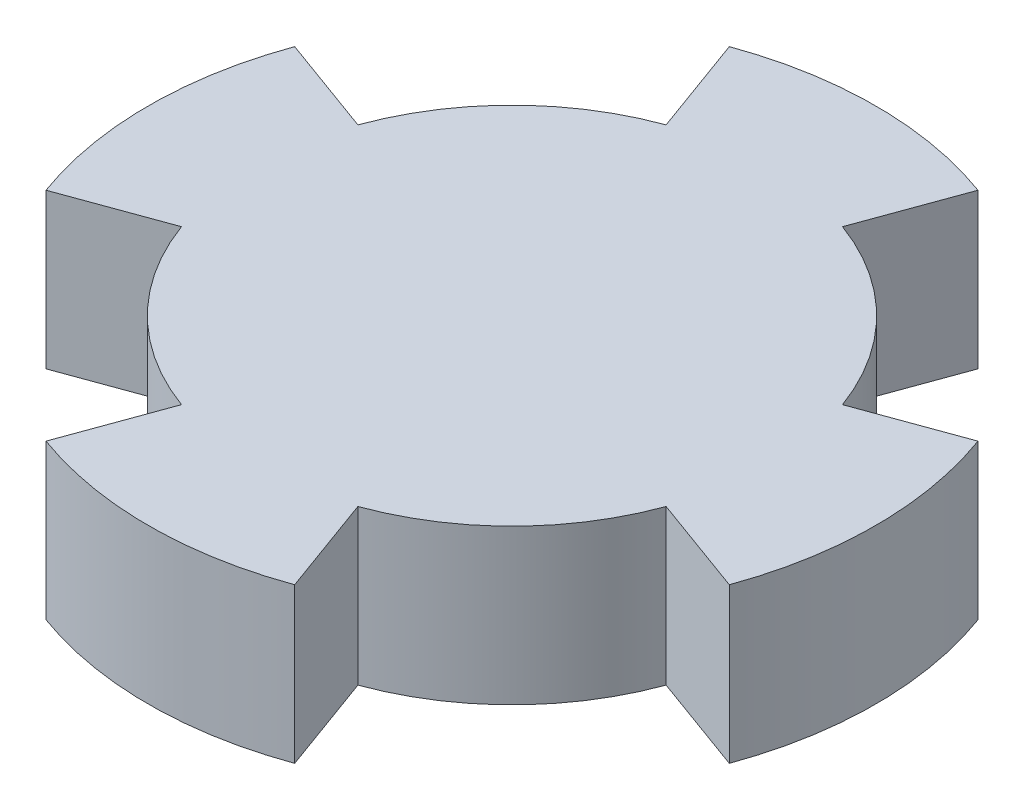
ISO-10303-21;
HEADER;
FILE_DESCRIPTION(('STEP AP214'),'2;1');
FILE_NAME('part.step','',(''),(''),'','','');
FILE_SCHEMA(('AUTOMOTIVE_DESIGN { 1 0 10303 214 1 1 1 1 }'));
ENDSEC;
DATA;
#1=APPLICATION_CONTEXT('core data for automotive mechanical design processes');
#2=APPLICATION_PROTOCOL_DEFINITION('international standard','automotive_design',2000,#1);
#3=PRODUCT_CONTEXT('',#1,'mechanical');
#4=PRODUCT('Part','Part','',(#3));
#5=PRODUCT_RELATED_PRODUCT_CATEGORY('part','',(#4));
#6=PRODUCT_DEFINITION_FORMATION('','',#4);
#7=PRODUCT_DEFINITION_CONTEXT('part definition',#1,'design');
#8=PRODUCT_DEFINITION('design','',#6,#7);
#9=PRODUCT_DEFINITION_SHAPE('','',#8);
#10=(LENGTH_UNIT() NAMED_UNIT(*) SI_UNIT(.MILLI.,.METRE.));
#11=(NAMED_UNIT(*) PLANE_ANGLE_UNIT() SI_UNIT($,.RADIAN.));
#12=(NAMED_UNIT(*) SI_UNIT($,.STERADIAN.) SOLID_ANGLE_UNIT());
#13=UNCERTAINTY_MEASURE_WITH_UNIT(LENGTH_MEASURE(1.E-05),#10,'distance_accuracy_value','');
#14=(GEOMETRIC_REPRESENTATION_CONTEXT(3) GLOBAL_UNCERTAINTY_ASSIGNED_CONTEXT((#13)) GLOBAL_UNIT_ASSIGNED_CONTEXT((#10,
#11,#12)) REPRESENTATION_CONTEXT('',''));
#15=CARTESIAN_POINT('',(0.,0.,0.));
#16=DIRECTION('',(0.,0.,1.));
#17=DIRECTION('',(1.,0.,0.));
#18=AXIS2_PLACEMENT_3D('',#15,#16,#17);
#19=CARTESIAN_POINT('',(0.,150.,0.));
#20=DIRECTION('',(0.,-1.,0.));
#21=DIRECTION('',(0.,0.,-1.));
#22=AXIS2_PLACEMENT_3D('',#19,#20,#21);
#23=CYLINDRICAL_SURFACE('',#22,352.5);
#24=CARTESIAN_POINT('',(0.,0.,0.));
#25=DIRECTION('',(0.,1.,0.));
#26=DIRECTION('',(0.,0.,1.));
#27=AXIS2_PLACEMENT_3D('',#24,#25,#26);
#28=CIRCLE('',#27,352.5);
#29=CARTESIAN_POINT('',(-120.562100522298,0.,331.241648827033));
#30=VERTEX_POINT('',#29);
#31=CARTESIAN_POINT('',(120.562100522295,0.,331.241648827034));
#32=VERTEX_POINT('',#31);
#33=EDGE_CURVE('E181',#30,#32,#28,.T.);
#34=ORIENTED_EDGE('',*,*,#33,.T.);
#35=DIRECTION('',(0.,-1.,0.));
#36=VECTOR('',#35,1.);
#37=CARTESIAN_POINT('',(120.562100522295,150.,331.241648827034));
#38=LINE('',#37,#36);
#39=CARTESIAN_POINT('',(120.562100522295,150.,331.241648827034));
#40=VERTEX_POINT('',#39);
#41=EDGE_CURVE('E11',#40,#32,#38,.T.);
#42=ORIENTED_EDGE('',*,*,#41,.F.);
#43=CARTESIAN_POINT('',(0.,150.,0.));
#44=DIRECTION('',(0.,1.,0.));
#45=DIRECTION('',(0.,0.,1.));
#46=AXIS2_PLACEMENT_3D('',#43,#44,#45);
#47=CIRCLE('',#46,352.5);
#48=CARTESIAN_POINT('',(-120.562100522298,150.,331.241648827033));
#49=VERTEX_POINT('',#48);
#50=EDGE_CURVE('E211',#49,#40,#47,.T.);
#51=ORIENTED_EDGE('',*,*,#50,.F.);
#52=DIRECTION('',(0.,-1.,0.));
#53=VECTOR('',#52,1.);
#54=CARTESIAN_POINT('',(-120.562100522298,150.,331.241648827033));
#55=LINE('',#54,#53);
#56=EDGE_CURVE('E177',#49,#30,#55,.T.);
#57=ORIENTED_EDGE('',*,*,#56,.T.);
#58=EDGE_LOOP('',(#34,#42,#51,#57));
#59=FACE_BOUND('',#58,.T.);
#60=ADVANCED_FACE('F37',(#59),#23,.T.);
#61=CARTESIAN_POINT('',(0.,150.,0.));
#62=DIRECTION('',(-0.939692620785912,0.,0.34202014332566));
#63=DIRECTION('',(0.34202014332566,0.,0.939692620785912));
#64=AXIS2_PLACEMENT_3D('',#61,#62,#63);
#65=PLANE('',#64);
#66=DIRECTION('',(-0.34202014332566,0.,-0.939692620785912));
#67=VECTOR('',#66,1.);
#68=CARTESIAN_POINT('',(0.,0.,0.));
#69=LINE('',#68,#67);
#70=CARTESIAN_POINT('',(85.5050358314149,0.,234.923155196478));
#71=VERTEX_POINT('',#70);
#72=EDGE_CURVE('E184',#32,#71,#69,.T.);
#73=ORIENTED_EDGE('',*,*,#72,.T.);
#74=DIRECTION('',(0.,-1.,0.));
#75=VECTOR('',#74,1.);
#76=CARTESIAN_POINT('',(85.5050358314149,150.,234.923155196478));
#77=LINE('',#76,#75);
#78=CARTESIAN_POINT('',(85.5050358314149,150.,234.923155196478));
#79=VERTEX_POINT('',#78);
#80=EDGE_CURVE('E45',#79,#71,#77,.T.);
#81=ORIENTED_EDGE('',*,*,#80,.F.);
#82=DIRECTION('',(-0.34202014332566,0.,-0.939692620785912));
#83=VECTOR('',#82,1.);
#84=CARTESIAN_POINT('',(0.,150.,0.));
#85=LINE('',#84,#83);
#86=EDGE_CURVE('E120',#40,#79,#85,.T.);
#87=ORIENTED_EDGE('',*,*,#86,.F.);
#88=ORIENTED_EDGE('',*,*,#41,.T.);
#89=EDGE_LOOP('',(#73,#81,#87,#88));
#90=FACE_BOUND('',#89,.T.);
#91=ADVANCED_FACE('F309',(#90),#65,.F.);
#92=CARTESIAN_POINT('',(0.,150.,0.));
#93=DIRECTION('',(0.,-1.,0.));
#94=DIRECTION('',(0.,0.,-1.));
#95=AXIS2_PLACEMENT_3D('',#92,#93,#94);
#96=CYLINDRICAL_SURFACE('',#95,250.);
#97=CARTESIAN_POINT('',(0.,0.,0.));
#98=DIRECTION('',(0.,1.,0.));
#99=DIRECTION('',(0.,0.,1.));
#100=AXIS2_PLACEMENT_3D('',#97,#98,#99);
#101=CIRCLE('',#100,250.);
#102=CARTESIAN_POINT('',(234.923155196476,0.,85.5050358314198));
#103=VERTEX_POINT('',#102);
#104=EDGE_CURVE('E186',#71,#103,#101,.T.);
#105=ORIENTED_EDGE('',*,*,#104,.T.);
#106=DIRECTION('',(0.,-1.,0.));
#107=VECTOR('',#106,1.);
#108=CARTESIAN_POINT('',(234.923155196476,150.,85.5050358314198));
#109=LINE('',#108,#107);
#110=CARTESIAN_POINT('',(234.923155196476,150.,85.5050358314198));
#111=VERTEX_POINT('',#110);
#112=EDGE_CURVE('E242',#111,#103,#109,.T.);
#113=ORIENTED_EDGE('',*,*,#112,.F.);
#114=CARTESIAN_POINT('',(0.,150.,0.));
#115=DIRECTION('',(0.,1.,0.));
#116=DIRECTION('',(0.,0.,1.));
#117=AXIS2_PLACEMENT_3D('',#114,#115,#116);
#118=CIRCLE('',#117,250.);
#119=EDGE_CURVE('E250',#79,#111,#118,.T.);
#120=ORIENTED_EDGE('',*,*,#119,.F.);
#121=ORIENTED_EDGE('',*,*,#80,.T.);
#122=EDGE_LOOP('',(#105,#113,#120,#121));
#123=FACE_BOUND('',#122,.T.);
#124=ADVANCED_FACE('F248',(#123),#96,.T.);
#125=CARTESIAN_POINT('',(0.,150.,0.));
#126=DIRECTION('',(0.342020143325679,0.,-0.939692620785905));
#127=DIRECTION('',(-0.939692620785905,0.,-0.342020143325679));
#128=AXIS2_PLACEMENT_3D('',#125,#126,#127);
#129=PLANE('',#128);
#130=DIRECTION('',(0.939692620785905,0.,0.342020143325679));
#131=VECTOR('',#130,1.);
#132=CARTESIAN_POINT('',(0.,0.,0.));
#133=LINE('',#132,#131);
#134=CARTESIAN_POINT('',(331.241648827031,0.,120.562100522302));
#135=VERTEX_POINT('',#134);
#136=EDGE_CURVE('E188',#103,#135,#133,.T.);
#137=ORIENTED_EDGE('',*,*,#136,.T.);
#138=DIRECTION('',(0.,-1.,0.));
#139=VECTOR('',#138,1.);
#140=CARTESIAN_POINT('',(331.241648827031,150.,120.562100522302));
#141=LINE('',#140,#139);
#142=CARTESIAN_POINT('',(331.241648827031,150.,120.562100522302));
#143=VERTEX_POINT('',#142);
#144=EDGE_CURVE('E239',#143,#135,#141,.T.);
#145=ORIENTED_EDGE('',*,*,#144,.F.);
#146=DIRECTION('',(0.939692620785905,0.,0.342020143325679));
#147=VECTOR('',#146,1.);
#148=CARTESIAN_POINT('',(0.,150.,0.));
#149=LINE('',#148,#147);
#150=EDGE_CURVE('E268',#111,#143,#149,.T.);
#151=ORIENTED_EDGE('',*,*,#150,.F.);
#152=ORIENTED_EDGE('',*,*,#112,.T.);
#153=EDGE_LOOP('',(#137,#145,#151,#152));
#154=FACE_BOUND('',#153,.T.);
#155=ADVANCED_FACE('F259',(#154),#129,.F.);
#156=CARTESIAN_POINT('',(0.,150.,0.));
#157=DIRECTION('',(0.,-1.,0.));
#158=DIRECTION('',(0.,0.,-1.));
#159=AXIS2_PLACEMENT_3D('',#156,#157,#158);
#160=CYLINDRICAL_SURFACE('',#159,352.5);
#161=CARTESIAN_POINT('',(0.,0.,0.));
#162=DIRECTION('',(0.,1.,0.));
#163=DIRECTION('',(0.,0.,1.));
#164=AXIS2_PLACEMENT_3D('',#161,#162,#163);
#165=CIRCLE('',#164,352.5);
#166=CARTESIAN_POINT('',(331.241648827033,0.,-120.562100522305));
#167=VERTEX_POINT('',#166);
#168=EDGE_CURVE('E190',#135,#167,#165,.T.);
#169=ORIENTED_EDGE('',*,*,#168,.T.);
#170=DIRECTION('',(0.,-1.,0.));
#171=VECTOR('',#170,1.);
#172=CARTESIAN_POINT('',(331.241648827033,150.,-120.562100522305));
#173=LINE('',#172,#171);
#174=CARTESIAN_POINT('',(331.241648827033,150.,-120.562100522305));
#175=VERTEX_POINT('',#174);
#176=EDGE_CURVE('E236',#175,#167,#173,.T.);
#177=ORIENTED_EDGE('',*,*,#176,.F.);
#178=CARTESIAN_POINT('',(0.,150.,0.));
#179=DIRECTION('',(0.,1.,0.));
#180=DIRECTION('',(0.,0.,1.));
#181=AXIS2_PLACEMENT_3D('',#178,#179,#180);
#182=CIRCLE('',#181,352.5);
#183=EDGE_CURVE('E265',#143,#175,#182,.T.);
#184=ORIENTED_EDGE('',*,*,#183,.F.);
#185=ORIENTED_EDGE('',*,*,#144,.T.);
#186=EDGE_LOOP('',(#169,#177,#184,#185));
#187=FACE_BOUND('',#186,.T.);
#188=ADVANCED_FACE('F263',(#187),#160,.T.);
#189=CARTESIAN_POINT('',(0.,150.,0.));
#190=DIRECTION('',(0.342020143325686,0.,0.939692620785902));
#191=DIRECTION('',(0.939692620785902,0.,-0.342020143325686));
#192=AXIS2_PLACEMENT_3D('',#189,#190,#191);
#193=PLANE('',#192);
#194=DIRECTION('',(-0.939692620785902,0.,0.342020143325686));
#195=VECTOR('',#194,1.);
#196=CARTESIAN_POINT('',(0.,0.,0.));
#197=LINE('',#196,#195);
#198=CARTESIAN_POINT('',(234.923155196478,0.,-85.5050358314223));
#199=VERTEX_POINT('',#198);
#200=EDGE_CURVE('E192',#167,#199,#197,.T.);
#201=ORIENTED_EDGE('',*,*,#200,.T.);
#202=DIRECTION('',(0.,-1.,0.));
#203=VECTOR('',#202,1.);
#204=CARTESIAN_POINT('',(234.923155196478,150.,-85.5050358314223));
#205=LINE('',#204,#203);
#206=CARTESIAN_POINT('',(234.923155196478,150.,-85.5050358314223));
#207=VERTEX_POINT('',#206);
#208=EDGE_CURVE('E233',#207,#199,#205,.T.);
#209=ORIENTED_EDGE('',*,*,#208,.F.);
#210=DIRECTION('',(-0.939692620785902,0.,0.342020143325686));
#211=VECTOR('',#210,1.);
#212=CARTESIAN_POINT('',(0.,150.,0.));
#213=LINE('',#212,#211);
#214=EDGE_CURVE('E267',#175,#207,#213,.T.);
#215=ORIENTED_EDGE('',*,*,#214,.F.);
#216=ORIENTED_EDGE('',*,*,#176,.T.);
#217=EDGE_LOOP('',(#201,#209,#215,#216));
#218=FACE_BOUND('',#217,.T.);
#219=ADVANCED_FACE('F322',(#218),#193,.F.);
#220=CARTESIAN_POINT('',(0.,150.,0.));
#221=DIRECTION('',(0.,-1.,0.));
#222=DIRECTION('',(0.,0.,-1.));
#223=AXIS2_PLACEMENT_3D('',#220,#221,#222);
#224=CYLINDRICAL_SURFACE('',#223,250.);
#225=CARTESIAN_POINT('',(0.,0.,0.));
#226=DIRECTION('',(0.,1.,0.));
#227=DIRECTION('',(0.,0.,1.));
#228=AXIS2_PLACEMENT_3D('',#225,#226,#227);
#229=CIRCLE('',#228,250.);
#230=CARTESIAN_POINT('',(85.505035831419,0.,-234.923155196476));
#231=VERTEX_POINT('',#230);
#232=EDGE_CURVE('E194',#199,#231,#229,.T.);
#233=ORIENTED_EDGE('',*,*,#232,.T.);
#234=DIRECTION('',(0.,-1.,0.));
#235=VECTOR('',#234,1.);
#236=CARTESIAN_POINT('',(85.505035831419,150.,-234.923155196476));
#237=LINE('',#236,#235);
#238=CARTESIAN_POINT('',(85.505035831419,150.,-234.923155196476));
#239=VERTEX_POINT('',#238);
#240=EDGE_CURVE('E230',#239,#231,#237,.T.);
#241=ORIENTED_EDGE('',*,*,#240,.F.);
#242=CARTESIAN_POINT('',(0.,150.,0.));
#243=DIRECTION('',(0.,1.,0.));
#244=DIRECTION('',(0.,0.,1.));
#245=AXIS2_PLACEMENT_3D('',#242,#243,#244);
#246=CIRCLE('',#245,250.);
#247=EDGE_CURVE('E270',#207,#239,#246,.T.);
#248=ORIENTED_EDGE('',*,*,#247,.F.);
#249=ORIENTED_EDGE('',*,*,#208,.T.);
#250=EDGE_LOOP('',(#233,#241,#248,#249));
#251=FACE_BOUND('',#250,.T.);
#252=ADVANCED_FACE('F325',(#251),#224,.T.);
#253=CARTESIAN_POINT('',(0.,150.,0.));
#254=DIRECTION('',(-0.939692620785906,0.,-0.342020143325676));
#255=DIRECTION('',(-0.342020143325676,0.,0.939692620785906));
#256=AXIS2_PLACEMENT_3D('',#253,#254,#255);
#257=PLANE('',#256);
#258=DIRECTION('',(0.342020143325676,0.,-0.939692620785906));
#259=VECTOR('',#258,1.);
#260=CARTESIAN_POINT('',(0.,0.,0.));
#261=LINE('',#260,#259);
#262=CARTESIAN_POINT('',(120.562100522301,0.,-331.241648827032));
#263=VERTEX_POINT('',#262);
#264=EDGE_CURVE('E196',#231,#263,#261,.T.);
#265=ORIENTED_EDGE('',*,*,#264,.T.);
#266=DIRECTION('',(0.,-1.,0.));
#267=VECTOR('',#266,1.);
#268=CARTESIAN_POINT('',(120.562100522301,150.,-331.241648827032));
#269=LINE('',#268,#267);
#270=CARTESIAN_POINT('',(120.562100522301,150.,-331.241648827032));
#271=VERTEX_POINT('',#270);
#272=EDGE_CURVE('E227',#271,#263,#269,.T.);
#273=ORIENTED_EDGE('',*,*,#272,.F.);
#274=DIRECTION('',(0.342020143325676,0.,-0.939692620785906));
#275=VECTOR('',#274,1.);
#276=CARTESIAN_POINT('',(0.,150.,0.));
#277=LINE('',#276,#275);
#278=EDGE_CURVE('E276',#239,#271,#277,.T.);
#279=ORIENTED_EDGE('',*,*,#278,.F.);
#280=ORIENTED_EDGE('',*,*,#240,.T.);
#281=EDGE_LOOP('',(#265,#273,#279,#280));
#282=FACE_BOUND('',#281,.T.);
#283=ADVANCED_FACE('F329',(#282),#257,.F.);
#284=CARTESIAN_POINT('',(0.,150.,0.));
#285=DIRECTION('',(0.,-1.,0.));
#286=DIRECTION('',(0.,0.,-1.));
#287=AXIS2_PLACEMENT_3D('',#284,#285,#286);
#288=CYLINDRICAL_SURFACE('',#287,352.5);
#289=CARTESIAN_POINT('',(0.,0.,0.));
#290=DIRECTION('',(0.,1.,0.));
#291=DIRECTION('',(0.,0.,1.));
#292=AXIS2_PLACEMENT_3D('',#289,#290,#291);
#293=CIRCLE('',#292,352.5);
#294=CARTESIAN_POINT('',(-120.562100522297,0.,-331.241648827033));
#295=VERTEX_POINT('',#294);
#296=EDGE_CURVE('E198',#263,#295,#293,.T.);
#297=ORIENTED_EDGE('',*,*,#296,.T.);
#298=DIRECTION('',(0.,-1.,0.));
#299=VECTOR('',#298,1.);
#300=CARTESIAN_POINT('',(-120.562100522297,150.,-331.241648827033));
#301=LINE('',#300,#299);
#302=CARTESIAN_POINT('',(-120.562100522297,150.,-331.241648827033));
#303=VERTEX_POINT('',#302);
#304=EDGE_CURVE('E224',#303,#295,#301,.T.);
#305=ORIENTED_EDGE('',*,*,#304,.F.);
#306=CARTESIAN_POINT('',(0.,150.,0.));
#307=DIRECTION('',(0.,1.,0.));
#308=DIRECTION('',(0.,0.,1.));
#309=AXIS2_PLACEMENT_3D('',#306,#307,#308);
#310=CIRCLE('',#309,352.5);
#311=EDGE_CURVE('E278',#271,#303,#310,.T.);
#312=ORIENTED_EDGE('',*,*,#311,.F.);
#313=ORIENTED_EDGE('',*,*,#272,.T.);
#314=EDGE_LOOP('',(#297,#305,#312,#313));
#315=FACE_BOUND('',#314,.T.);
#316=ADVANCED_FACE('F333',(#315),#288,.T.);
#317=CARTESIAN_POINT('',(0.,150.,0.));
#318=DIRECTION('',(0.939692620785909,0.,-0.342020143325666));
#319=DIRECTION('',(-0.342020143325666,0.,-0.939692620785909));
#320=AXIS2_PLACEMENT_3D('',#317,#318,#319);
#321=PLANE('',#320);
#322=DIRECTION('',(0.342020143325666,0.,0.939692620785909));
#323=VECTOR('',#322,1.);
#324=CARTESIAN_POINT('',(0.,0.,0.));
#325=LINE('',#324,#323);
#326=CARTESIAN_POINT('',(-85.5050358314165,0.,-234.923155196477));
#327=VERTEX_POINT('',#326);
#328=EDGE_CURVE('E200',#295,#327,#325,.T.);
#329=ORIENTED_EDGE('',*,*,#328,.T.);
#330=DIRECTION('',(0.,-1.,0.));
#331=VECTOR('',#330,1.);
#332=CARTESIAN_POINT('',(-85.5050358314165,150.,-234.923155196477));
#333=LINE('',#332,#331);
#334=CARTESIAN_POINT('',(-85.5050358314165,150.,-234.923155196477));
#335=VERTEX_POINT('',#334);
#336=EDGE_CURVE('E221',#335,#327,#333,.T.);
#337=ORIENTED_EDGE('',*,*,#336,.F.);
#338=DIRECTION('',(0.342020143325666,0.,0.939692620785909));
#339=VECTOR('',#338,1.);
#340=CARTESIAN_POINT('',(0.,150.,0.));
#341=LINE('',#340,#339);
#342=EDGE_CURVE('E280',#303,#335,#341,.T.);
#343=ORIENTED_EDGE('',*,*,#342,.F.);
#344=ORIENTED_EDGE('',*,*,#304,.T.);
#345=EDGE_LOOP('',(#329,#337,#343,#344));
#346=FACE_BOUND('',#345,.T.);
#347=ADVANCED_FACE('F337',(#346),#321,.F.);
#348=CARTESIAN_POINT('',(0.,150.,0.));
#349=DIRECTION('',(0.,-1.,0.));
#350=DIRECTION('',(0.,0.,-1.));
#351=AXIS2_PLACEMENT_3D('',#348,#349,#350);
#352=CYLINDRICAL_SURFACE('',#351,250.);
#353=CARTESIAN_POINT('',(0.,0.,0.));
#354=DIRECTION('',(0.,1.,0.));
#355=DIRECTION('',(0.,0.,1.));
#356=AXIS2_PLACEMENT_3D('',#353,#354,#355);
#357=CIRCLE('',#356,250.);
#358=CARTESIAN_POINT('',(-234.923155196477,0.,-85.5050358314182));
#359=VERTEX_POINT('',#358);
#360=EDGE_CURVE('E202',#327,#359,#357,.T.);
#361=ORIENTED_EDGE('',*,*,#360,.T.);
#362=DIRECTION('',(0.,-1.,0.));
#363=VECTOR('',#362,1.);
#364=CARTESIAN_POINT('',(-234.923155196477,150.,-85.5050358314182));
#365=LINE('',#364,#363);
#366=CARTESIAN_POINT('',(-234.923155196477,150.,-85.5050358314182));
#367=VERTEX_POINT('',#366);
#368=EDGE_CURVE('E218',#367,#359,#365,.T.);
#369=ORIENTED_EDGE('',*,*,#368,.F.);
#370=CARTESIAN_POINT('',(0.,150.,0.));
#371=DIRECTION('',(0.,1.,0.));
#372=DIRECTION('',(0.,0.,1.));
#373=AXIS2_PLACEMENT_3D('',#370,#371,#372);
#374=CIRCLE('',#373,250.);
#375=EDGE_CURVE('E282',#335,#367,#374,.T.);
#376=ORIENTED_EDGE('',*,*,#375,.F.);
#377=ORIENTED_EDGE('',*,*,#336,.T.);
#378=EDGE_LOOP('',(#361,#369,#376,#377));
#379=FACE_BOUND('',#378,.T.);
#380=ADVANCED_FACE('F341',(#379),#352,.T.);
#381=CARTESIAN_POINT('',(0.,150.,0.));
#382=DIRECTION('',(-0.342020143325673,0.,0.939692620785907));
#383=DIRECTION('',(0.939692620785907,0.,0.342020143325673));
#384=AXIS2_PLACEMENT_3D('',#381,#382,#383);
#385=PLANE('',#384);
#386=DIRECTION('',(-0.939692620785907,0.,-0.342020143325673));
#387=VECTOR('',#386,1.);
#388=CARTESIAN_POINT('',(0.,0.,0.));
#389=LINE('',#388,#387);
#390=CARTESIAN_POINT('',(-331.241648827032,0.,-120.5621005223));
#391=VERTEX_POINT('',#390);
#392=EDGE_CURVE('E204',#359,#391,#389,.T.);
#393=ORIENTED_EDGE('',*,*,#392,.T.);
#394=DIRECTION('',(0.,-1.,0.));
#395=VECTOR('',#394,1.);
#396=CARTESIAN_POINT('',(-331.241648827032,150.,-120.5621005223));
#397=LINE('',#396,#395);
#398=CARTESIAN_POINT('',(-331.241648827032,150.,-120.5621005223));
#399=VERTEX_POINT('',#398);
#400=EDGE_CURVE('E215',#399,#391,#397,.T.);
#401=ORIENTED_EDGE('',*,*,#400,.F.);
#402=DIRECTION('',(-0.939692620785907,0.,-0.342020143325673));
#403=VECTOR('',#402,1.);
#404=CARTESIAN_POINT('',(0.,150.,0.));
#405=LINE('',#404,#403);
#406=EDGE_CURVE('E284',#367,#399,#405,.T.);
#407=ORIENTED_EDGE('',*,*,#406,.F.);
#408=ORIENTED_EDGE('',*,*,#368,.T.);
#409=EDGE_LOOP('',(#393,#401,#407,#408));
#410=FACE_BOUND('',#409,.T.);
#411=ADVANCED_FACE('F290',(#410),#385,.F.);
#412=CARTESIAN_POINT('',(0.,150.,0.));
#413=DIRECTION('',(0.,-1.,0.));
#414=DIRECTION('',(0.,0.,-1.));
#415=AXIS2_PLACEMENT_3D('',#412,#413,#414);
#416=CYLINDRICAL_SURFACE('',#415,352.5);
#417=CARTESIAN_POINT('',(0.,0.,0.));
#418=DIRECTION('',(0.,1.,0.));
#419=DIRECTION('',(0.,0.,1.));
#420=AXIS2_PLACEMENT_3D('',#417,#418,#419);
#421=CIRCLE('',#420,352.5);
#422=CARTESIAN_POINT('',(-331.241648827033,0.,120.562100522299));
#423=VERTEX_POINT('',#422);
#424=EDGE_CURVE('E206',#391,#423,#421,.T.);
#425=ORIENTED_EDGE('',*,*,#424,.T.);
#426=DIRECTION('',(0.,-1.,0.));
#427=VECTOR('',#426,1.);
#428=CARTESIAN_POINT('',(-331.241648827033,150.,120.562100522299));
#429=LINE('',#428,#427);
#430=CARTESIAN_POINT('',(-331.241648827033,150.,120.562100522299));
#431=VERTEX_POINT('',#430);
#432=EDGE_CURVE('E172',#431,#423,#429,.T.);
#433=ORIENTED_EDGE('',*,*,#432,.F.);
#434=CARTESIAN_POINT('',(0.,150.,0.));
#435=DIRECTION('',(0.,1.,0.));
#436=DIRECTION('',(0.,0.,1.));
#437=AXIS2_PLACEMENT_3D('',#434,#435,#436);
#438=CIRCLE('',#437,352.5);
#439=EDGE_CURVE('E163',#399,#431,#438,.T.);
#440=ORIENTED_EDGE('',*,*,#439,.F.);
#441=ORIENTED_EDGE('',*,*,#400,.T.);
#442=EDGE_LOOP('',(#425,#433,#440,#441));
#443=FACE_BOUND('',#442,.T.);
#444=ADVANCED_FACE('F294',(#443),#416,.T.);
#445=CARTESIAN_POINT('',(0.,150.,0.));
#446=DIRECTION('',(-0.34202014332567,0.,-0.939692620785908));
#447=DIRECTION('',(-0.939692620785908,0.,0.34202014332567));
#448=AXIS2_PLACEMENT_3D('',#445,#446,#447);
#449=PLANE('',#448);
#450=DIRECTION('',(0.939692620785908,0.,-0.34202014332567));
#451=VECTOR('',#450,1.);
#452=CARTESIAN_POINT('',(0.,0.,0.));
#453=LINE('',#452,#451);
#454=CARTESIAN_POINT('',(-234.923155196477,0.,85.5050358314174));
#455=VERTEX_POINT('',#454);
#456=EDGE_CURVE('E171',#423,#455,#453,.T.);
#457=ORIENTED_EDGE('',*,*,#456,.T.);
#458=DIRECTION('',(0.,-1.,0.));
#459=VECTOR('',#458,1.);
#460=CARTESIAN_POINT('',(-234.923155196477,150.,85.5050358314174));
#461=LINE('',#460,#459);
#462=CARTESIAN_POINT('',(-234.923155196477,150.,85.5050358314174));
#463=VERTEX_POINT('',#462);
#464=EDGE_CURVE('E168',#463,#455,#461,.T.);
#465=ORIENTED_EDGE('',*,*,#464,.F.);
#466=DIRECTION('',(0.939692620785908,0.,-0.34202014332567));
#467=VECTOR('',#466,1.);
#468=CARTESIAN_POINT('',(0.,150.,0.));
#469=LINE('',#468,#467);
#470=EDGE_CURVE('E157',#431,#463,#469,.T.);
#471=ORIENTED_EDGE('',*,*,#470,.F.);
#472=ORIENTED_EDGE('',*,*,#432,.T.);
#473=EDGE_LOOP('',(#457,#465,#471,#472));
#474=FACE_BOUND('',#473,.T.);
#475=ADVANCED_FACE('F169',(#474),#449,.F.);
#476=CARTESIAN_POINT('',(0.,150.,0.));
#477=DIRECTION('',(0.,-1.,0.));
#478=DIRECTION('',(0.,0.,-1.));
#479=AXIS2_PLACEMENT_3D('',#476,#477,#478);
#480=CYLINDRICAL_SURFACE('',#479,250.);
#481=CARTESIAN_POINT('',(0.,0.,0.));
#482=DIRECTION('',(0.,1.,0.));
#483=DIRECTION('',(0.,0.,1.));
#484=AXIS2_PLACEMENT_3D('',#481,#482,#483);
#485=CIRCLE('',#484,250.);
#486=CARTESIAN_POINT('',(-85.5050358314173,0.,234.923155196477));
#487=VERTEX_POINT('',#486);
#488=EDGE_CURVE('E106',#455,#487,#485,.T.);
#489=ORIENTED_EDGE('',*,*,#488,.T.);
#490=DIRECTION('',(0.,-1.,0.));
#491=VECTOR('',#490,1.);
#492=CARTESIAN_POINT('',(-85.5050358314173,150.,234.923155196477));
#493=LINE('',#492,#491);
#494=CARTESIAN_POINT('',(-85.5050358314173,150.,234.923155196477));
#495=VERTEX_POINT('',#494);
#496=EDGE_CURVE('E173',#495,#487,#493,.T.);
#497=ORIENTED_EDGE('',*,*,#496,.F.);
#498=CARTESIAN_POINT('',(0.,150.,0.));
#499=DIRECTION('',(0.,1.,0.));
#500=DIRECTION('',(0.,0.,1.));
#501=AXIS2_PLACEMENT_3D('',#498,#499,#500);
#502=CIRCLE('',#501,250.);
#503=EDGE_CURVE('E161',#463,#495,#502,.T.);
#504=ORIENTED_EDGE('',*,*,#503,.F.);
#505=ORIENTED_EDGE('',*,*,#464,.T.);
#506=EDGE_LOOP('',(#489,#497,#504,#505));
#507=FACE_BOUND('',#506,.T.);
#508=ADVANCED_FACE('F175',(#507),#480,.T.);
#509=CARTESIAN_POINT('',(0.,150.,0.));
#510=DIRECTION('',(0.939692620785908,0.,0.342020143325669));
#511=DIRECTION('',(0.342020143325669,0.,-0.939692620785908));
#512=AXIS2_PLACEMENT_3D('',#509,#510,#511);
#513=PLANE('',#512);
#514=DIRECTION('',(-0.342020143325669,0.,0.939692620785908));
#515=VECTOR('',#514,1.);
#516=CARTESIAN_POINT('',(0.,0.,0.));
#517=LINE('',#516,#515);
#518=EDGE_CURVE('E112',#487,#30,#517,.T.);
#519=ORIENTED_EDGE('',*,*,#518,.T.);
#520=ORIENTED_EDGE('',*,*,#56,.F.);
#521=DIRECTION('',(-0.342020143325669,0.,0.939692620785908));
#522=VECTOR('',#521,1.);
#523=CARTESIAN_POINT('',(0.,150.,0.));
#524=LINE('',#523,#522);
#525=EDGE_CURVE('E53',#495,#49,#524,.T.);
#526=ORIENTED_EDGE('',*,*,#525,.F.);
#527=ORIENTED_EDGE('',*,*,#496,.T.);
#528=EDGE_LOOP('',(#519,#520,#526,#527));
#529=FACE_BOUND('',#528,.T.);
#530=ADVANCED_FACE('F298',(#529),#513,.F.);
#531=CARTESIAN_POINT('',(0.,150.,0.));
#532=DIRECTION('',(0.,1.,0.));
#533=DIRECTION('',(0.,0.,1.));
#534=AXIS2_PLACEMENT_3D('',#531,#532,#533);
#535=PLANE('',#534);
#536=ORIENTED_EDGE('',*,*,#50,.T.);
#537=ORIENTED_EDGE('',*,*,#86,.T.);
#538=ORIENTED_EDGE('',*,*,#119,.T.);
#539=ORIENTED_EDGE('',*,*,#150,.T.);
#540=ORIENTED_EDGE('',*,*,#183,.T.);
#541=ORIENTED_EDGE('',*,*,#214,.T.);
#542=ORIENTED_EDGE('',*,*,#247,.T.);
#543=ORIENTED_EDGE('',*,*,#278,.T.);
#544=ORIENTED_EDGE('',*,*,#311,.T.);
#545=ORIENTED_EDGE('',*,*,#342,.T.);
#546=ORIENTED_EDGE('',*,*,#375,.T.);
#547=ORIENTED_EDGE('',*,*,#406,.T.);
#548=ORIENTED_EDGE('',*,*,#439,.T.);
#549=ORIENTED_EDGE('',*,*,#470,.T.);
#550=ORIENTED_EDGE('',*,*,#503,.T.);
#551=ORIENTED_EDGE('',*,*,#525,.T.);
#552=EDGE_LOOP('',(#536,#537,#538,#539,#540,#541,#542,#543,#544,#545,#546,#547,#548,#549,#550,#551));
#553=FACE_BOUND('',#552,.T.);
#554=ADVANCED_FACE('F159',(#553),#535,.T.);
#555=CARTESIAN_POINT('',(0.,0.,0.));
#556=DIRECTION('',(0.,1.,0.));
#557=DIRECTION('',(0.,0.,1.));
#558=AXIS2_PLACEMENT_3D('',#555,#556,#557);
#559=PLANE('',#558);
#560=ORIENTED_EDGE('',*,*,#33,.F.);
#561=ORIENTED_EDGE('',*,*,#518,.F.);
#562=ORIENTED_EDGE('',*,*,#488,.F.);
#563=ORIENTED_EDGE('',*,*,#456,.F.);
#564=ORIENTED_EDGE('',*,*,#424,.F.);
#565=ORIENTED_EDGE('',*,*,#392,.F.);
#566=ORIENTED_EDGE('',*,*,#360,.F.);
#567=ORIENTED_EDGE('',*,*,#328,.F.);
#568=ORIENTED_EDGE('',*,*,#296,.F.);
#569=ORIENTED_EDGE('',*,*,#264,.F.);
#570=ORIENTED_EDGE('',*,*,#232,.F.);
#571=ORIENTED_EDGE('',*,*,#200,.F.);
#572=ORIENTED_EDGE('',*,*,#168,.F.);
#573=ORIENTED_EDGE('',*,*,#136,.F.);
#574=ORIENTED_EDGE('',*,*,#104,.F.);
#575=ORIENTED_EDGE('',*,*,#72,.F.);
#576=EDGE_LOOP('',(#560,#561,#562,#563,#564,#565,#566,#567,#568,#569,#570,#571,#572,#573,#574,#575));
#577=FACE_BOUND('',#576,.T.);
#578=ADVANCED_FACE('F254',(#577),#559,.F.);
#579=CLOSED_SHELL('',(#60,#91,#124,#155,#188,#219,#252,#283,#316,#347,#380,#411,#444,#475,#508,
#530,#554,#578));
#580=MANIFOLD_SOLID_BREP('B2',#579);
#581=ADVANCED_BREP_SHAPE_REPRESENTATION('',(#18,#580),#14);
#582=SHAPE_DEFINITION_REPRESENTATION(#9,#581);
ENDSEC;
END-ISO-10303-21;
